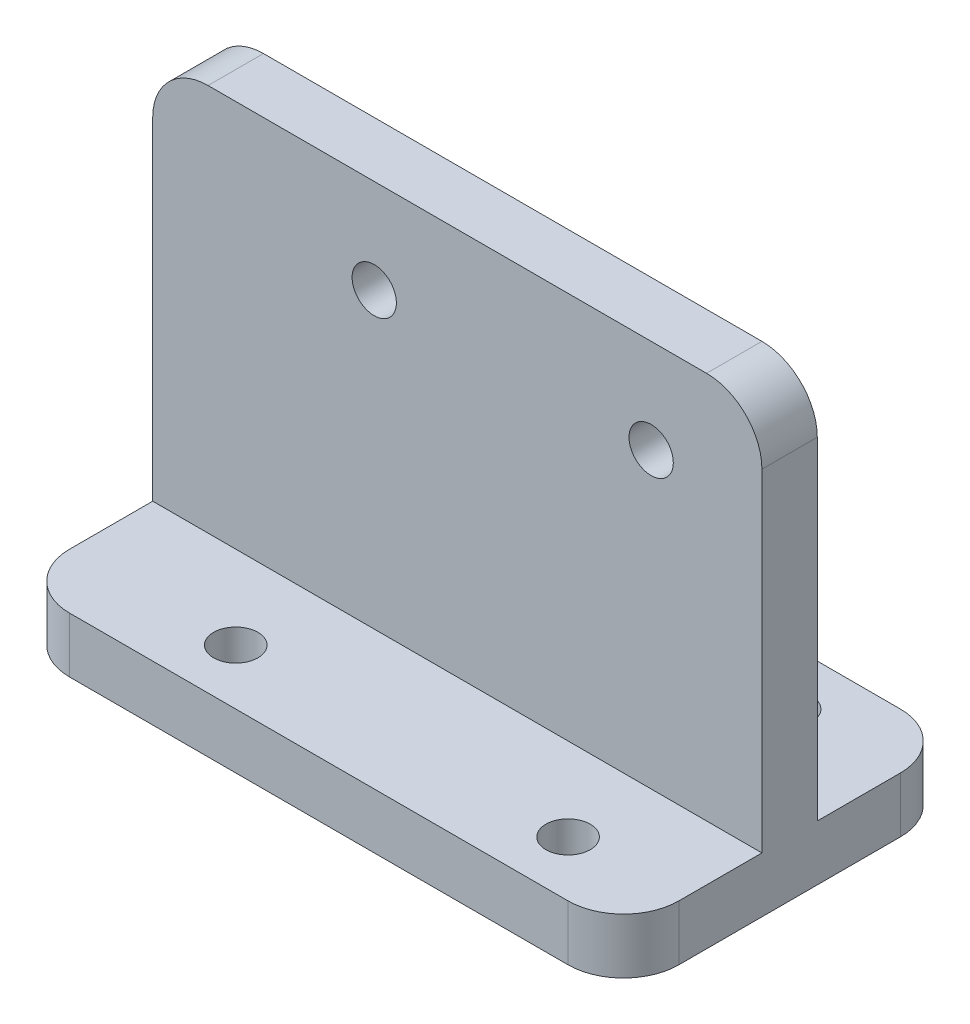
ISO-10303-21;
HEADER;
FILE_DESCRIPTION(('STEP AP214'),'2;1');
FILE_NAME('part.step','',(''),(''),'','','');
FILE_SCHEMA(('AUTOMOTIVE_DESIGN { 1 0 10303 214 1 1 1 1 }'));
ENDSEC;
DATA;
#1=APPLICATION_CONTEXT('core data for automotive mechanical design processes');
#2=APPLICATION_PROTOCOL_DEFINITION('international standard','automotive_design',2000,#1);
#3=PRODUCT_CONTEXT('',#1,'mechanical');
#4=PRODUCT('Part','Part','',(#3));
#5=PRODUCT_RELATED_PRODUCT_CATEGORY('part','',(#4));
#6=PRODUCT_DEFINITION_FORMATION('','',#4);
#7=PRODUCT_DEFINITION_CONTEXT('part definition',#1,'design');
#8=PRODUCT_DEFINITION('design','',#6,#7);
#9=PRODUCT_DEFINITION_SHAPE('','',#8);
#10=(LENGTH_UNIT() NAMED_UNIT(*) SI_UNIT(.MILLI.,.METRE.));
#11=(NAMED_UNIT(*) PLANE_ANGLE_UNIT() SI_UNIT($,.RADIAN.));
#12=(NAMED_UNIT(*) SI_UNIT($,.STERADIAN.) SOLID_ANGLE_UNIT());
#13=UNCERTAINTY_MEASURE_WITH_UNIT(LENGTH_MEASURE(1.E-05),#10,'distance_accuracy_value','');
#14=(GEOMETRIC_REPRESENTATION_CONTEXT(3) GLOBAL_UNCERTAINTY_ASSIGNED_CONTEXT((#13)) GLOBAL_UNIT_ASSIGNED_CONTEXT((#10,
#11,#12)) REPRESENTATION_CONTEXT('',''));
#15=CARTESIAN_POINT('',(0.,0.,0.));
#16=DIRECTION('',(0.,0.,1.));
#17=DIRECTION('',(1.,0.,0.));
#18=AXIS2_PLACEMENT_3D('',#15,#16,#17);
#19=CARTESIAN_POINT('',(0.,0.,5.));
#20=DIRECTION('',(0.,0.,-1.));
#21=DIRECTION('',(-1.,0.,0.));
#22=AXIS2_PLACEMENT_3D('',#19,#20,#21);
#23=PLANE('',#22);
#24=DIRECTION('',(0.,1.,0.));
#25=VECTOR('',#24,1.);
#26=CARTESIAN_POINT('',(55.,0.,5.));
#27=LINE('',#26,#25);
#28=CARTESIAN_POINT('',(55.,0.,5.));
#29=VERTEX_POINT('',#28);
#30=CARTESIAN_POINT('',(55.,30.,5.));
#31=VERTEX_POINT('',#30);
#32=EDGE_CURVE('E175',#29,#31,#27,.T.);
#33=ORIENTED_EDGE('',*,*,#32,.T.);
#34=CARTESIAN_POINT('',(50.,30.,5.));
#35=DIRECTION('',(0.,0.,-1.));
#36=DIRECTION('',(-1.,0.,0.));
#37=AXIS2_PLACEMENT_3D('',#34,#35,#36);
#38=CIRCLE('',#37,5.);
#39=CARTESIAN_POINT('',(50.,35.,5.));
#40=VERTEX_POINT('',#39);
#41=EDGE_CURVE('E224',#31,#40,#38,.F.);
#42=ORIENTED_EDGE('',*,*,#41,.T.);
#43=DIRECTION('',(-1.,0.,0.));
#44=VECTOR('',#43,1.);
#45=CARTESIAN_POINT('',(0.,35.,5.));
#46=LINE('',#45,#44);
#47=CARTESIAN_POINT('',(5.,35.,5.));
#48=VERTEX_POINT('',#47);
#49=EDGE_CURVE('E178',#40,#48,#46,.T.);
#50=ORIENTED_EDGE('',*,*,#49,.T.);
#51=CARTESIAN_POINT('',(5.,30.,5.));
#52=DIRECTION('',(0.,0.,-1.));
#53=DIRECTION('',(-1.,0.,0.));
#54=AXIS2_PLACEMENT_3D('',#51,#52,#53);
#55=CIRCLE('',#54,5.);
#56=CARTESIAN_POINT('',(0.,30.,5.));
#57=VERTEX_POINT('',#56);
#58=EDGE_CURVE('E167',#48,#57,#55,.F.);
#59=ORIENTED_EDGE('',*,*,#58,.T.);
#60=DIRECTION('',(0.,-1.,0.));
#61=VECTOR('',#60,1.);
#62=CARTESIAN_POINT('',(0.,0.,5.));
#63=LINE('',#62,#61);
#64=CARTESIAN_POINT('',(0.,0.,5.));
#65=VERTEX_POINT('',#64);
#66=EDGE_CURVE('E151',#57,#65,#63,.T.);
#67=ORIENTED_EDGE('',*,*,#66,.T.);
#68=DIRECTION('',(1.,0.,0.));
#69=VECTOR('',#68,1.);
#70=CARTESIAN_POINT('',(0.,0.,5.));
#71=LINE('',#70,#69);
#72=EDGE_CURVE('E163',#65,#29,#71,.T.);
#73=ORIENTED_EDGE('',*,*,#72,.T.);
#74=EDGE_LOOP('',(#33,#42,#50,#59,#67,#73));
#75=FACE_BOUND('',#74,.T.);
#76=CARTESIAN_POINT('',(20.,26.5,5.));
#77=DIRECTION('',(0.,0.,1.));
#78=DIRECTION('',(1.,0.,0.));
#79=AXIS2_PLACEMENT_3D('',#76,#77,#78);
#80=CIRCLE('',#79,2.);
#81=CARTESIAN_POINT('',(22.,26.5,5.));
#82=VERTEX_POINT('',#81);
#83=EDGE_CURVE('E189',#82,#82,#80,.T.);
#84=ORIENTED_EDGE('',*,*,#83,.F.);
#85=EDGE_LOOP('',(#84));
#86=FACE_BOUND('',#85,.T.);
#87=CARTESIAN_POINT('',(45.,26.5,5.));
#88=DIRECTION('',(0.,0.,1.));
#89=DIRECTION('',(1.,0.,0.));
#90=AXIS2_PLACEMENT_3D('',#87,#88,#89);
#91=CIRCLE('',#90,2.);
#92=CARTESIAN_POINT('',(47.,26.5,5.));
#93=VERTEX_POINT('',#92);
#94=EDGE_CURVE('E301',#93,#93,#91,.T.);
#95=ORIENTED_EDGE('',*,*,#94,.F.);
#96=EDGE_LOOP('',(#95));
#97=FACE_BOUND('',#96,.T.);
#98=ADVANCED_FACE('F45',(#75,#86,#97),#23,.F.);
#99=CARTESIAN_POINT('',(0.,0.,0.));
#100=DIRECTION('',(0.,0.,-1.));
#101=DIRECTION('',(-1.,0.,0.));
#102=AXIS2_PLACEMENT_3D('',#99,#100,#101);
#103=PLANE('',#102);
#104=CARTESIAN_POINT('',(20.,26.5,0.));
#105=DIRECTION('',(0.,0.,1.));
#106=DIRECTION('',(1.,0.,0.));
#107=AXIS2_PLACEMENT_3D('',#104,#105,#106);
#108=CIRCLE('',#107,2.);
#109=CARTESIAN_POINT('',(22.,26.5,0.));
#110=VERTEX_POINT('',#109);
#111=EDGE_CURVE('E305',#110,#110,#108,.T.);
#112=ORIENTED_EDGE('',*,*,#111,.T.);
#113=EDGE_LOOP('',(#112));
#114=FACE_BOUND('',#113,.T.);
#115=DIRECTION('',(-1.,0.,0.));
#116=VECTOR('',#115,1.);
#117=CARTESIAN_POINT('',(0.,35.,0.));
#118=LINE('',#117,#116);
#119=CARTESIAN_POINT('',(50.,35.,0.));
#120=VERTEX_POINT('',#119);
#121=CARTESIAN_POINT('',(5.,35.,0.));
#122=VERTEX_POINT('',#121);
#123=EDGE_CURVE('E169',#120,#122,#118,.T.);
#124=ORIENTED_EDGE('',*,*,#123,.F.);
#125=CARTESIAN_POINT('',(50.,30.,0.));
#126=DIRECTION('',(0.,0.,-1.));
#127=DIRECTION('',(-1.,0.,0.));
#128=AXIS2_PLACEMENT_3D('',#125,#126,#127);
#129=CIRCLE('',#128,5.);
#130=CARTESIAN_POINT('',(55.,30.,0.));
#131=VERTEX_POINT('',#130);
#132=EDGE_CURVE('E209',#120,#131,#129,.T.);
#133=ORIENTED_EDGE('',*,*,#132,.T.);
#134=DIRECTION('',(0.,1.,0.));
#135=VECTOR('',#134,1.);
#136=CARTESIAN_POINT('',(55.,0.,0.));
#137=LINE('',#136,#135);
#138=CARTESIAN_POINT('',(55.,0.,0.));
#139=VERTEX_POINT('',#138);
#140=EDGE_CURVE('E193',#139,#131,#137,.T.);
#141=ORIENTED_EDGE('',*,*,#140,.F.);
#142=DIRECTION('',(1.,0.,0.));
#143=VECTOR('',#142,1.);
#144=CARTESIAN_POINT('',(0.,0.,0.));
#145=LINE('',#144,#143);
#146=CARTESIAN_POINT('',(0.,0.,0.));
#147=VERTEX_POINT('',#146);
#148=EDGE_CURVE('E188',#147,#139,#145,.T.);
#149=ORIENTED_EDGE('',*,*,#148,.F.);
#150=DIRECTION('',(0.,-1.,0.));
#151=VECTOR('',#150,1.);
#152=CARTESIAN_POINT('',(0.,0.,0.));
#153=LINE('',#152,#151);
#154=CARTESIAN_POINT('',(0.,30.,0.));
#155=VERTEX_POINT('',#154);
#156=EDGE_CURVE('E185',#155,#147,#153,.T.);
#157=ORIENTED_EDGE('',*,*,#156,.F.);
#158=CARTESIAN_POINT('',(5.,30.,0.));
#159=DIRECTION('',(0.,0.,-1.));
#160=DIRECTION('',(-1.,0.,0.));
#161=AXIS2_PLACEMENT_3D('',#158,#159,#160);
#162=CIRCLE('',#161,5.);
#163=EDGE_CURVE('E206',#155,#122,#162,.T.);
#164=ORIENTED_EDGE('',*,*,#163,.T.);
#165=EDGE_LOOP('',(#124,#133,#141,#149,#157,#164));
#166=FACE_BOUND('',#165,.T.);
#167=CARTESIAN_POINT('',(45.,26.5,0.));
#168=DIRECTION('',(0.,0.,1.));
#169=DIRECTION('',(1.,0.,0.));
#170=AXIS2_PLACEMENT_3D('',#167,#168,#169);
#171=CIRCLE('',#170,2.);
#172=CARTESIAN_POINT('',(47.,26.5,0.));
#173=VERTEX_POINT('',#172);
#174=EDGE_CURVE('E306',#173,#173,#171,.T.);
#175=ORIENTED_EDGE('',*,*,#174,.T.);
#176=EDGE_LOOP('',(#175));
#177=FACE_BOUND('',#176,.T.);
#178=ADVANCED_FACE('F273',(#114,#166,#177),#103,.T.);
#179=CARTESIAN_POINT('',(0.,0.,5.));
#180=DIRECTION('',(1.,0.,0.));
#181=DIRECTION('',(0.,0.,-1.));
#182=AXIS2_PLACEMENT_3D('',#179,#180,#181);
#183=PLANE('',#182);
#184=DIRECTION('',(0.,0.,-1.));
#185=VECTOR('',#184,1.);
#186=CARTESIAN_POINT('',(0.,0.,-12.5));
#187=LINE('',#186,#185);
#188=CARTESIAN_POINT('',(0.,0.,-7.5));
#189=VERTEX_POINT('',#188);
#190=EDGE_CURVE('E157',#147,#189,#187,.T.);
#191=ORIENTED_EDGE('',*,*,#190,.T.);
#192=DIRECTION('',(0.,1.,0.));
#193=VECTOR('',#192,1.);
#194=CARTESIAN_POINT('',(0.,0.,-7.5));
#195=LINE('',#194,#193);
#196=CARTESIAN_POINT('',(0.,-5.,-7.5));
#197=VERTEX_POINT('',#196);
#198=EDGE_CURVE('E11',#189,#197,#195,.F.);
#199=ORIENTED_EDGE('',*,*,#198,.T.);
#200=DIRECTION('',(0.,0.,-1.));
#201=VECTOR('',#200,1.);
#202=CARTESIAN_POINT('',(0.,-5.,-12.5));
#203=LINE('',#202,#201);
#204=CARTESIAN_POINT('',(0.,-5.,12.5));
#205=VERTEX_POINT('',#204);
#206=EDGE_CURVE('E300',#205,#197,#203,.T.);
#207=ORIENTED_EDGE('',*,*,#206,.F.);
#208=DIRECTION('',(0.,1.,0.));
#209=VECTOR('',#208,1.);
#210=CARTESIAN_POINT('',(0.,0.,12.5));
#211=LINE('',#210,#209);
#212=CARTESIAN_POINT('',(0.,0.,12.5));
#213=VERTEX_POINT('',#212);
#214=EDGE_CURVE('E54',#205,#213,#211,.T.);
#215=ORIENTED_EDGE('',*,*,#214,.T.);
#216=EDGE_CURVE('E146',#213,#65,#187,.T.);
#217=ORIENTED_EDGE('',*,*,#216,.T.);
#218=ORIENTED_EDGE('',*,*,#66,.F.);
#219=DIRECTION('',(0.,0.,-1.));
#220=VECTOR('',#219,1.);
#221=CARTESIAN_POINT('',(0.,30.,5.));
#222=LINE('',#221,#220);
#223=EDGE_CURVE('E264',#57,#155,#222,.T.);
#224=ORIENTED_EDGE('',*,*,#223,.T.);
#225=ORIENTED_EDGE('',*,*,#156,.T.);
#226=EDGE_LOOP('',(#191,#199,#207,#215,#217,#218,#224,#225));
#227=FACE_BOUND('',#226,.T.);
#228=ADVANCED_FACE('F149',(#227),#183,.F.);
#229=CARTESIAN_POINT('',(55.,0.,5.));
#230=DIRECTION('',(-1.,0.,0.));
#231=DIRECTION('',(0.,0.,1.));
#232=AXIS2_PLACEMENT_3D('',#229,#230,#231);
#233=PLANE('',#232);
#234=ORIENTED_EDGE('',*,*,#140,.T.);
#235=DIRECTION('',(0.,0.,-1.));
#236=VECTOR('',#235,1.);
#237=CARTESIAN_POINT('',(55.,30.,5.));
#238=LINE('',#237,#236);
#239=EDGE_CURVE('E219',#131,#31,#238,.F.);
#240=ORIENTED_EDGE('',*,*,#239,.T.);
#241=ORIENTED_EDGE('',*,*,#32,.F.);
#242=DIRECTION('',(0.,0.,1.));
#243=VECTOR('',#242,1.);
#244=CARTESIAN_POINT('',(55.,0.,-12.5));
#245=LINE('',#244,#243);
#246=CARTESIAN_POINT('',(55.,0.,12.5));
#247=VERTEX_POINT('',#246);
#248=EDGE_CURVE('E173',#29,#247,#245,.T.);
#249=ORIENTED_EDGE('',*,*,#248,.T.);
#250=DIRECTION('',(0.,1.,0.));
#251=VECTOR('',#250,1.);
#252=CARTESIAN_POINT('',(55.,0.,12.5));
#253=LINE('',#252,#251);
#254=CARTESIAN_POINT('',(55.,-5.,12.5));
#255=VERTEX_POINT('',#254);
#256=EDGE_CURVE('E212',#247,#255,#253,.F.);
#257=ORIENTED_EDGE('',*,*,#256,.T.);
#258=DIRECTION('',(0.,0.,1.));
#259=VECTOR('',#258,1.);
#260=CARTESIAN_POINT('',(55.,-5.,-12.5));
#261=LINE('',#260,#259);
#262=CARTESIAN_POINT('',(55.,-5.,-7.5));
#263=VERTEX_POINT('',#262);
#264=EDGE_CURVE('E378',#263,#255,#261,.T.);
#265=ORIENTED_EDGE('',*,*,#264,.F.);
#266=DIRECTION('',(0.,1.,0.));
#267=VECTOR('',#266,1.);
#268=CARTESIAN_POINT('',(55.,0.,-7.5));
#269=LINE('',#268,#267);
#270=CARTESIAN_POINT('',(55.,0.,-7.5));
#271=VERTEX_POINT('',#270);
#272=EDGE_CURVE('E215',#263,#271,#269,.T.);
#273=ORIENTED_EDGE('',*,*,#272,.T.);
#274=EDGE_CURVE('E279',#271,#139,#245,.T.);
#275=ORIENTED_EDGE('',*,*,#274,.T.);
#276=EDGE_LOOP('',(#234,#240,#241,#249,#257,#265,#273,#275));
#277=FACE_BOUND('',#276,.T.);
#278=ADVANCED_FACE('F329',(#277),#233,.F.);
#279=CARTESIAN_POINT('',(0.,35.,5.));
#280=DIRECTION('',(0.,-1.,0.));
#281=DIRECTION('',(0.,0.,-1.));
#282=AXIS2_PLACEMENT_3D('',#279,#280,#281);
#283=PLANE('',#282);
#284=ORIENTED_EDGE('',*,*,#49,.F.);
#285=DIRECTION('',(0.,0.,-1.));
#286=VECTOR('',#285,1.);
#287=CARTESIAN_POINT('',(50.,35.,5.));
#288=LINE('',#287,#286);
#289=EDGE_CURVE('E202',#40,#120,#288,.T.);
#290=ORIENTED_EDGE('',*,*,#289,.T.);
#291=ORIENTED_EDGE('',*,*,#123,.T.);
#292=DIRECTION('',(0.,0.,-1.));
#293=VECTOR('',#292,1.);
#294=CARTESIAN_POINT('',(5.,35.,5.));
#295=LINE('',#294,#293);
#296=EDGE_CURVE('E184',#122,#48,#295,.F.);
#297=ORIENTED_EDGE('',*,*,#296,.T.);
#298=EDGE_LOOP('',(#284,#290,#291,#297));
#299=FACE_BOUND('',#298,.T.);
#300=ADVANCED_FACE('F320',(#299),#283,.F.);
#301=CARTESIAN_POINT('',(20.,26.5,5.));
#302=DIRECTION('',(0.,0.,-1.));
#303=DIRECTION('',(-1.,0.,0.));
#304=AXIS2_PLACEMENT_3D('',#301,#302,#303);
#305=CYLINDRICAL_SURFACE('',#304,2.);
#306=ORIENTED_EDGE('',*,*,#83,.T.);
#307=EDGE_LOOP('',(#306));
#308=FACE_BOUND('',#307,.T.);
#309=ORIENTED_EDGE('',*,*,#111,.F.);
#310=EDGE_LOOP('',(#309));
#311=FACE_BOUND('',#310,.T.);
#312=ADVANCED_FACE('F317',(#308,#311),#305,.F.);
#313=CARTESIAN_POINT('',(45.,26.5,5.));
#314=DIRECTION('',(0.,0.,-1.));
#315=DIRECTION('',(-1.,0.,0.));
#316=AXIS2_PLACEMENT_3D('',#313,#314,#315);
#317=CYLINDRICAL_SURFACE('',#316,2.);
#318=ORIENTED_EDGE('',*,*,#94,.T.);
#319=EDGE_LOOP('',(#318));
#320=FACE_BOUND('',#319,.T.);
#321=ORIENTED_EDGE('',*,*,#174,.F.);
#322=EDGE_LOOP('',(#321));
#323=FACE_BOUND('',#322,.T.);
#324=ADVANCED_FACE('F319',(#320,#323),#317,.F.);
#325=CARTESIAN_POINT('',(0.,0.,0.));
#326=DIRECTION('',(0.,1.,0.));
#327=DIRECTION('',(0.,0.,1.));
#328=AXIS2_PLACEMENT_3D('',#325,#326,#327);
#329=PLANE('',#328);
#330=CARTESIAN_POINT('',(45.,0.,12.5));
#331=DIRECTION('',(0.,-1.,0.));
#332=DIRECTION('',(0.,0.,-1.));
#333=AXIS2_PLACEMENT_3D('',#330,#331,#332);
#334=CIRCLE('',#333,2.);
#335=CARTESIAN_POINT('',(45.,0.,10.5));
#336=VERTEX_POINT('',#335);
#337=EDGE_CURVE('E436',#336,#336,#334,.T.);
#338=ORIENTED_EDGE('',*,*,#337,.T.);
#339=EDGE_LOOP('',(#338));
#340=FACE_BOUND('',#339,.T.);
#341=CARTESIAN_POINT('',(15.,0.,12.5));
#342=DIRECTION('',(0.,-1.,0.));
#343=DIRECTION('',(0.,0.,-1.));
#344=AXIS2_PLACEMENT_3D('',#341,#342,#343);
#345=CIRCLE('',#344,2.);
#346=CARTESIAN_POINT('',(15.,0.,10.5));
#347=VERTEX_POINT('',#346);
#348=EDGE_CURVE('E283',#347,#347,#345,.T.);
#349=ORIENTED_EDGE('',*,*,#348,.T.);
#350=EDGE_LOOP('',(#349));
#351=FACE_BOUND('',#350,.T.);
#352=DIRECTION('',(-1.,0.,0.));
#353=VECTOR('',#352,1.);
#354=CARTESIAN_POINT('',(0.,0.,17.5));
#355=LINE('',#354,#353);
#356=CARTESIAN_POINT('',(50.,0.,17.5));
#357=VERTEX_POINT('',#356);
#358=CARTESIAN_POINT('',(5.,0.,17.5));
#359=VERTEX_POINT('',#358);
#360=EDGE_CURVE('E297',#357,#359,#355,.T.);
#361=ORIENTED_EDGE('',*,*,#360,.F.);
#362=CARTESIAN_POINT('',(50.,0.,12.5));
#363=DIRECTION('',(0.,1.,0.));
#364=DIRECTION('',(0.,0.,1.));
#365=AXIS2_PLACEMENT_3D('',#362,#363,#364);
#366=CIRCLE('',#365,5.);
#367=EDGE_CURVE('E261',#357,#247,#366,.T.);
#368=ORIENTED_EDGE('',*,*,#367,.T.);
#369=ORIENTED_EDGE('',*,*,#248,.F.);
#370=ORIENTED_EDGE('',*,*,#72,.F.);
#371=ORIENTED_EDGE('',*,*,#216,.F.);
#372=CARTESIAN_POINT('',(5.,0.,12.5));
#373=DIRECTION('',(0.,1.,0.));
#374=DIRECTION('',(0.,0.,1.));
#375=AXIS2_PLACEMENT_3D('',#372,#373,#374);
#376=CIRCLE('',#375,5.);
#377=EDGE_CURVE('E61',#213,#359,#376,.T.);
#378=ORIENTED_EDGE('',*,*,#377,.T.);
#379=EDGE_LOOP('',(#361,#368,#369,#370,#371,#378));
#380=FACE_BOUND('',#379,.T.);
#381=ADVANCED_FACE('F171',(#340,#351,#380),#329,.T.);
#382=CARTESIAN_POINT('',(0.,-5.,-12.5));
#383=DIRECTION('',(0.,0.,1.));
#384=DIRECTION('',(1.,0.,0.));
#385=AXIS2_PLACEMENT_3D('',#382,#383,#384);
#386=PLANE('',#385);
#387=DIRECTION('',(1.,0.,0.));
#388=VECTOR('',#387,1.);
#389=CARTESIAN_POINT('',(0.,0.,-12.5));
#390=LINE('',#389,#388);
#391=CARTESIAN_POINT('',(5.,0.,-12.5));
#392=VERTEX_POINT('',#391);
#393=CARTESIAN_POINT('',(50.,0.,-12.5));
#394=VERTEX_POINT('',#393);
#395=EDGE_CURVE('E156',#392,#394,#390,.T.);
#396=ORIENTED_EDGE('',*,*,#395,.T.);
#397=DIRECTION('',(0.,1.,0.));
#398=VECTOR('',#397,1.);
#399=CARTESIAN_POINT('',(50.,-5.,-12.5));
#400=LINE('',#399,#398);
#401=CARTESIAN_POINT('',(50.,-5.,-12.5));
#402=VERTEX_POINT('',#401);
#403=EDGE_CURVE('E237',#394,#402,#400,.F.);
#404=ORIENTED_EDGE('',*,*,#403,.T.);
#405=DIRECTION('',(1.,0.,0.));
#406=VECTOR('',#405,1.);
#407=CARTESIAN_POINT('',(0.,-5.,-12.5));
#408=LINE('',#407,#406);
#409=CARTESIAN_POINT('',(5.,-5.,-12.5));
#410=VERTEX_POINT('',#409);
#411=EDGE_CURVE('E375',#410,#402,#408,.T.);
#412=ORIENTED_EDGE('',*,*,#411,.F.);
#413=DIRECTION('',(0.,1.,0.));
#414=VECTOR('',#413,1.);
#415=CARTESIAN_POINT('',(5.,-5.,-12.5));
#416=LINE('',#415,#414);
#417=EDGE_CURVE('E233',#410,#392,#416,.T.);
#418=ORIENTED_EDGE('',*,*,#417,.T.);
#419=EDGE_LOOP('',(#396,#404,#412,#418));
#420=FACE_BOUND('',#419,.T.);
#421=ADVANCED_FACE('F400',(#420),#386,.F.);
#422=CARTESIAN_POINT('',(0.,-5.,17.5));
#423=DIRECTION('',(0.,0.,-1.));
#424=DIRECTION('',(-1.,0.,0.));
#425=AXIS2_PLACEMENT_3D('',#422,#423,#424);
#426=PLANE('',#425);
#427=DIRECTION('',(-1.,0.,0.));
#428=VECTOR('',#427,1.);
#429=CARTESIAN_POINT('',(0.,-5.,17.5));
#430=LINE('',#429,#428);
#431=CARTESIAN_POINT('',(50.,-5.,17.5));
#432=VERTEX_POINT('',#431);
#433=CARTESIAN_POINT('',(5.,-5.,17.5));
#434=VERTEX_POINT('',#433);
#435=EDGE_CURVE('E290',#432,#434,#430,.T.);
#436=ORIENTED_EDGE('',*,*,#435,.F.);
#437=DIRECTION('',(0.,1.,0.));
#438=VECTOR('',#437,1.);
#439=CARTESIAN_POINT('',(50.,-5.,17.5));
#440=LINE('',#439,#438);
#441=EDGE_CURVE('E255',#432,#357,#440,.T.);
#442=ORIENTED_EDGE('',*,*,#441,.T.);
#443=ORIENTED_EDGE('',*,*,#360,.T.);
#444=DIRECTION('',(0.,1.,0.));
#445=VECTOR('',#444,1.);
#446=CARTESIAN_POINT('',(5.,-5.,17.5));
#447=LINE('',#446,#445);
#448=EDGE_CURVE('E252',#359,#434,#447,.F.);
#449=ORIENTED_EDGE('',*,*,#448,.T.);
#450=EDGE_LOOP('',(#436,#442,#443,#449));
#451=FACE_BOUND('',#450,.T.);
#452=ADVANCED_FACE('F391',(#451),#426,.F.);
#453=CARTESIAN_POINT('',(0.,-5.,0.));
#454=DIRECTION('',(0.,1.,0.));
#455=DIRECTION('',(0.,0.,1.));
#456=AXIS2_PLACEMENT_3D('',#453,#454,#455);
#457=PLANE('',#456);
#458=CARTESIAN_POINT('',(15.,-5.,-7.5));
#459=DIRECTION('',(0.,-1.,0.));
#460=DIRECTION('',(0.,0.,-1.));
#461=AXIS2_PLACEMENT_3D('',#458,#459,#460);
#462=CIRCLE('',#461,2.);
#463=CARTESIAN_POINT('',(15.,-5.,-9.5));
#464=VERTEX_POINT('',#463);
#465=EDGE_CURVE('E458',#464,#464,#462,.T.);
#466=ORIENTED_EDGE('',*,*,#465,.F.);
#467=EDGE_LOOP('',(#466));
#468=FACE_BOUND('',#467,.T.);
#469=CARTESIAN_POINT('',(45.,-5.,-7.5));
#470=DIRECTION('',(0.,-1.,0.));
#471=DIRECTION('',(0.,0.,-1.));
#472=AXIS2_PLACEMENT_3D('',#469,#470,#471);
#473=CIRCLE('',#472,2.);
#474=CARTESIAN_POINT('',(45.,-5.,-9.5));
#475=VERTEX_POINT('',#474);
#476=EDGE_CURVE('E448',#475,#475,#473,.T.);
#477=ORIENTED_EDGE('',*,*,#476,.F.);
#478=EDGE_LOOP('',(#477));
#479=FACE_BOUND('',#478,.T.);
#480=CARTESIAN_POINT('',(45.,-5.,12.5));
#481=DIRECTION('',(0.,-1.,0.));
#482=DIRECTION('',(0.,0.,-1.));
#483=AXIS2_PLACEMENT_3D('',#480,#481,#482);
#484=CIRCLE('',#483,2.);
#485=CARTESIAN_POINT('',(45.,-5.,10.5));
#486=VERTEX_POINT('',#485);
#487=EDGE_CURVE('E439',#486,#486,#484,.T.);
#488=ORIENTED_EDGE('',*,*,#487,.F.);
#489=EDGE_LOOP('',(#488));
#490=FACE_BOUND('',#489,.T.);
#491=CARTESIAN_POINT('',(15.,-5.,12.5));
#492=DIRECTION('',(0.,-1.,0.));
#493=DIRECTION('',(0.,0.,-1.));
#494=AXIS2_PLACEMENT_3D('',#491,#492,#493);
#495=CIRCLE('',#494,2.);
#496=CARTESIAN_POINT('',(15.,-5.,10.5));
#497=VERTEX_POINT('',#496);
#498=EDGE_CURVE('E286',#497,#497,#495,.T.);
#499=ORIENTED_EDGE('',*,*,#498,.F.);
#500=EDGE_LOOP('',(#499));
#501=FACE_BOUND('',#500,.T.);
#502=ORIENTED_EDGE('',*,*,#411,.T.);
#503=CARTESIAN_POINT('',(50.,-5.,-7.5));
#504=DIRECTION('',(0.,1.,0.));
#505=DIRECTION('',(0.,0.,1.));
#506=AXIS2_PLACEMENT_3D('',#503,#504,#505);
#507=CIRCLE('',#506,5.);
#508=EDGE_CURVE('E249',#402,#263,#507,.F.);
#509=ORIENTED_EDGE('',*,*,#508,.T.);
#510=ORIENTED_EDGE('',*,*,#264,.T.);
#511=CARTESIAN_POINT('',(50.,-5.,12.5));
#512=DIRECTION('',(0.,1.,0.));
#513=DIRECTION('',(0.,0.,1.));
#514=AXIS2_PLACEMENT_3D('',#511,#512,#513);
#515=CIRCLE('',#514,5.);
#516=EDGE_CURVE('E246',#255,#432,#515,.F.);
#517=ORIENTED_EDGE('',*,*,#516,.T.);
#518=ORIENTED_EDGE('',*,*,#435,.T.);
#519=CARTESIAN_POINT('',(5.,-5.,12.5));
#520=DIRECTION('',(0.,1.,0.));
#521=DIRECTION('',(0.,0.,1.));
#522=AXIS2_PLACEMENT_3D('',#519,#520,#521);
#523=CIRCLE('',#522,5.);
#524=EDGE_CURVE('E240',#434,#205,#523,.F.);
#525=ORIENTED_EDGE('',*,*,#524,.T.);
#526=ORIENTED_EDGE('',*,*,#206,.T.);
#527=CARTESIAN_POINT('',(5.,-5.,-7.5));
#528=DIRECTION('',(0.,1.,0.));
#529=DIRECTION('',(0.,0.,1.));
#530=AXIS2_PLACEMENT_3D('',#527,#528,#529);
#531=CIRCLE('',#530,5.);
#532=EDGE_CURVE('E243',#197,#410,#531,.F.);
#533=ORIENTED_EDGE('',*,*,#532,.T.);
#534=EDGE_LOOP('',(#502,#509,#510,#517,#518,#525,#526,#533));
#535=FACE_BOUND('',#534,.T.);
#536=ADVANCED_FACE('F371',(#468,#479,#490,#501,#535),#457,.F.);
#537=CARTESIAN_POINT('',(15.,0.,-7.5));
#538=DIRECTION('',(0.,-1.,0.));
#539=DIRECTION('',(0.,0.,-1.));
#540=AXIS2_PLACEMENT_3D('',#537,#538,#539);
#541=CIRCLE('',#540,2.);
#542=CARTESIAN_POINT('',(15.,0.,-9.5));
#543=VERTEX_POINT('',#542);
#544=EDGE_CURVE('E454',#543,#543,#541,.T.);
#545=ORIENTED_EDGE('',*,*,#544,.T.);
#546=EDGE_LOOP('',(#545));
#547=FACE_BOUND('',#546,.T.);
#548=CARTESIAN_POINT('',(45.,0.,-7.5));
#549=DIRECTION('',(0.,-1.,0.));
#550=DIRECTION('',(0.,0.,-1.));
#551=AXIS2_PLACEMENT_3D('',#548,#549,#550);
#552=CIRCLE('',#551,2.);
#553=CARTESIAN_POINT('',(45.,0.,-9.5));
#554=VERTEX_POINT('',#553);
#555=EDGE_CURVE('E442',#554,#554,#552,.T.);
#556=ORIENTED_EDGE('',*,*,#555,.T.);
#557=EDGE_LOOP('',(#556));
#558=FACE_BOUND('',#557,.T.);
#559=ORIENTED_EDGE('',*,*,#274,.F.);
#560=CARTESIAN_POINT('',(50.,0.,-7.5));
#561=DIRECTION('',(0.,1.,0.));
#562=DIRECTION('',(0.,0.,1.));
#563=AXIS2_PLACEMENT_3D('',#560,#561,#562);
#564=CIRCLE('',#563,5.);
#565=EDGE_CURVE('E230',#271,#394,#564,.T.);
#566=ORIENTED_EDGE('',*,*,#565,.T.);
#567=ORIENTED_EDGE('',*,*,#395,.F.);
#568=CARTESIAN_POINT('',(5.,0.,-7.5));
#569=DIRECTION('',(0.,1.,0.));
#570=DIRECTION('',(0.,0.,1.));
#571=AXIS2_PLACEMENT_3D('',#568,#569,#570);
#572=CIRCLE('',#571,5.);
#573=EDGE_CURVE('E227',#392,#189,#572,.T.);
#574=ORIENTED_EDGE('',*,*,#573,.T.);
#575=ORIENTED_EDGE('',*,*,#190,.F.);
#576=ORIENTED_EDGE('',*,*,#148,.T.);
#577=EDGE_LOOP('',(#559,#566,#567,#574,#575,#576));
#578=FACE_BOUND('',#577,.T.);
#579=ADVANCED_FACE('F278',(#547,#558,#578),#329,.T.);
#580=CARTESIAN_POINT('',(45.,0.,-7.5));
#581=DIRECTION('',(0.,-1.,0.));
#582=DIRECTION('',(0.,0.,-1.));
#583=AXIS2_PLACEMENT_3D('',#580,#581,#582);
#584=CYLINDRICAL_SURFACE('',#583,2.);
#585=ORIENTED_EDGE('',*,*,#555,.F.);
#586=EDGE_LOOP('',(#585));
#587=FACE_BOUND('',#586,.T.);
#588=ORIENTED_EDGE('',*,*,#476,.T.);
#589=EDGE_LOOP('',(#588));
#590=FACE_BOUND('',#589,.T.);
#591=ADVANCED_FACE('F414',(#587,#590),#584,.F.);
#592=CARTESIAN_POINT('',(15.,0.,-7.5));
#593=DIRECTION('',(0.,-1.,0.));
#594=DIRECTION('',(0.,0.,-1.));
#595=AXIS2_PLACEMENT_3D('',#592,#593,#594);
#596=CYLINDRICAL_SURFACE('',#595,2.);
#597=ORIENTED_EDGE('',*,*,#544,.F.);
#598=EDGE_LOOP('',(#597));
#599=FACE_BOUND('',#598,.T.);
#600=ORIENTED_EDGE('',*,*,#465,.T.);
#601=EDGE_LOOP('',(#600));
#602=FACE_BOUND('',#601,.T.);
#603=ADVANCED_FACE('F422',(#599,#602),#596,.F.);
#604=CARTESIAN_POINT('',(15.,0.,12.5));
#605=DIRECTION('',(0.,-1.,0.));
#606=DIRECTION('',(0.,0.,-1.));
#607=AXIS2_PLACEMENT_3D('',#604,#605,#606);
#608=CYLINDRICAL_SURFACE('',#607,2.);
#609=ORIENTED_EDGE('',*,*,#348,.F.);
#610=EDGE_LOOP('',(#609));
#611=FACE_BOUND('',#610,.T.);
#612=ORIENTED_EDGE('',*,*,#498,.T.);
#613=EDGE_LOOP('',(#612));
#614=FACE_BOUND('',#613,.T.);
#615=ADVANCED_FACE('F419',(#611,#614),#608,.F.);
#616=CARTESIAN_POINT('',(45.,0.,12.5));
#617=DIRECTION('',(0.,-1.,0.));
#618=DIRECTION('',(0.,0.,-1.));
#619=AXIS2_PLACEMENT_3D('',#616,#617,#618);
#620=CYLINDRICAL_SURFACE('',#619,2.);
#621=ORIENTED_EDGE('',*,*,#337,.F.);
#622=EDGE_LOOP('',(#621));
#623=FACE_BOUND('',#622,.T.);
#624=ORIENTED_EDGE('',*,*,#487,.T.);
#625=EDGE_LOOP('',(#624));
#626=FACE_BOUND('',#625,.T.);
#627=ADVANCED_FACE('F349',(#623,#626),#620,.F.);
#628=CARTESIAN_POINT('',(50.,30.,5.));
#629=DIRECTION('',(0.,0.,-1.));
#630=DIRECTION('',(-1.,0.,0.));
#631=AXIS2_PLACEMENT_3D('',#628,#629,#630);
#632=CYLINDRICAL_SURFACE('',#631,5.);
#633=ORIENTED_EDGE('',*,*,#41,.F.);
#634=ORIENTED_EDGE('',*,*,#239,.F.);
#635=ORIENTED_EDGE('',*,*,#132,.F.);
#636=ORIENTED_EDGE('',*,*,#289,.F.);
#637=EDGE_LOOP('',(#633,#634,#635,#636));
#638=FACE_BOUND('',#637,.T.);
#639=ADVANCED_FACE('F345',(#638),#632,.T.);
#640=CARTESIAN_POINT('',(50.,0.,-7.5));
#641=DIRECTION('',(0.,1.,0.));
#642=DIRECTION('',(0.,0.,1.));
#643=AXIS2_PLACEMENT_3D('',#640,#641,#642);
#644=CYLINDRICAL_SURFACE('',#643,5.);
#645=ORIENTED_EDGE('',*,*,#508,.F.);
#646=ORIENTED_EDGE('',*,*,#403,.F.);
#647=ORIENTED_EDGE('',*,*,#565,.F.);
#648=ORIENTED_EDGE('',*,*,#272,.F.);
#649=EDGE_LOOP('',(#645,#646,#647,#648));
#650=FACE_BOUND('',#649,.T.);
#651=ADVANCED_FACE('F348',(#650),#644,.T.);
#652=CARTESIAN_POINT('',(50.,-5.,12.5));
#653=DIRECTION('',(0.,1.,0.));
#654=DIRECTION('',(0.,0.,1.));
#655=AXIS2_PLACEMENT_3D('',#652,#653,#654);
#656=CYLINDRICAL_SURFACE('',#655,5.);
#657=ORIENTED_EDGE('',*,*,#516,.F.);
#658=ORIENTED_EDGE('',*,*,#256,.F.);
#659=ORIENTED_EDGE('',*,*,#367,.F.);
#660=ORIENTED_EDGE('',*,*,#441,.F.);
#661=EDGE_LOOP('',(#657,#658,#659,#660));
#662=FACE_BOUND('',#661,.T.);
#663=ADVANCED_FACE('F353',(#662),#656,.T.);
#664=CARTESIAN_POINT('',(5.,-5.,-7.5));
#665=DIRECTION('',(0.,1.,0.));
#666=DIRECTION('',(0.,0.,1.));
#667=AXIS2_PLACEMENT_3D('',#664,#665,#666);
#668=CYLINDRICAL_SURFACE('',#667,5.);
#669=ORIENTED_EDGE('',*,*,#532,.F.);
#670=ORIENTED_EDGE('',*,*,#198,.F.);
#671=ORIENTED_EDGE('',*,*,#573,.F.);
#672=ORIENTED_EDGE('',*,*,#417,.F.);
#673=EDGE_LOOP('',(#669,#670,#671,#672));
#674=FACE_BOUND('',#673,.T.);
#675=ADVANCED_FACE('F357',(#674),#668,.T.);
#676=CARTESIAN_POINT('',(5.,0.,12.5));
#677=DIRECTION('',(0.,1.,0.));
#678=DIRECTION('',(0.,0.,1.));
#679=AXIS2_PLACEMENT_3D('',#676,#677,#678);
#680=CYLINDRICAL_SURFACE('',#679,5.);
#681=ORIENTED_EDGE('',*,*,#524,.F.);
#682=ORIENTED_EDGE('',*,*,#448,.F.);
#683=ORIENTED_EDGE('',*,*,#377,.F.);
#684=ORIENTED_EDGE('',*,*,#214,.F.);
#685=EDGE_LOOP('',(#681,#682,#683,#684));
#686=FACE_BOUND('',#685,.T.);
#687=ADVANCED_FACE('F360',(#686),#680,.T.);
#688=CARTESIAN_POINT('',(5.,30.,5.));
#689=DIRECTION('',(0.,0.,-1.));
#690=DIRECTION('',(-1.,0.,0.));
#691=AXIS2_PLACEMENT_3D('',#688,#689,#690);
#692=CYLINDRICAL_SURFACE('',#691,5.);
#693=ORIENTED_EDGE('',*,*,#58,.F.);
#694=ORIENTED_EDGE('',*,*,#296,.F.);
#695=ORIENTED_EDGE('',*,*,#163,.F.);
#696=ORIENTED_EDGE('',*,*,#223,.F.);
#697=EDGE_LOOP('',(#693,#694,#695,#696));
#698=FACE_BOUND('',#697,.T.);
#699=ADVANCED_FACE('F47',(#698),#692,.T.);
#700=CLOSED_SHELL('',(#98,#178,#228,#278,#300,#312,#324,#381,#421,#452,#536,#579,#591,#603,#615,
#627,#639,#651,#663,#675,#687,#699));
#701=MANIFOLD_SOLID_BREP('B2',#700);
#702=ADVANCED_BREP_SHAPE_REPRESENTATION('',(#18,#701),#14);
#703=SHAPE_DEFINITION_REPRESENTATION(#9,#702);
ENDSEC;
END-ISO-10303-21;
